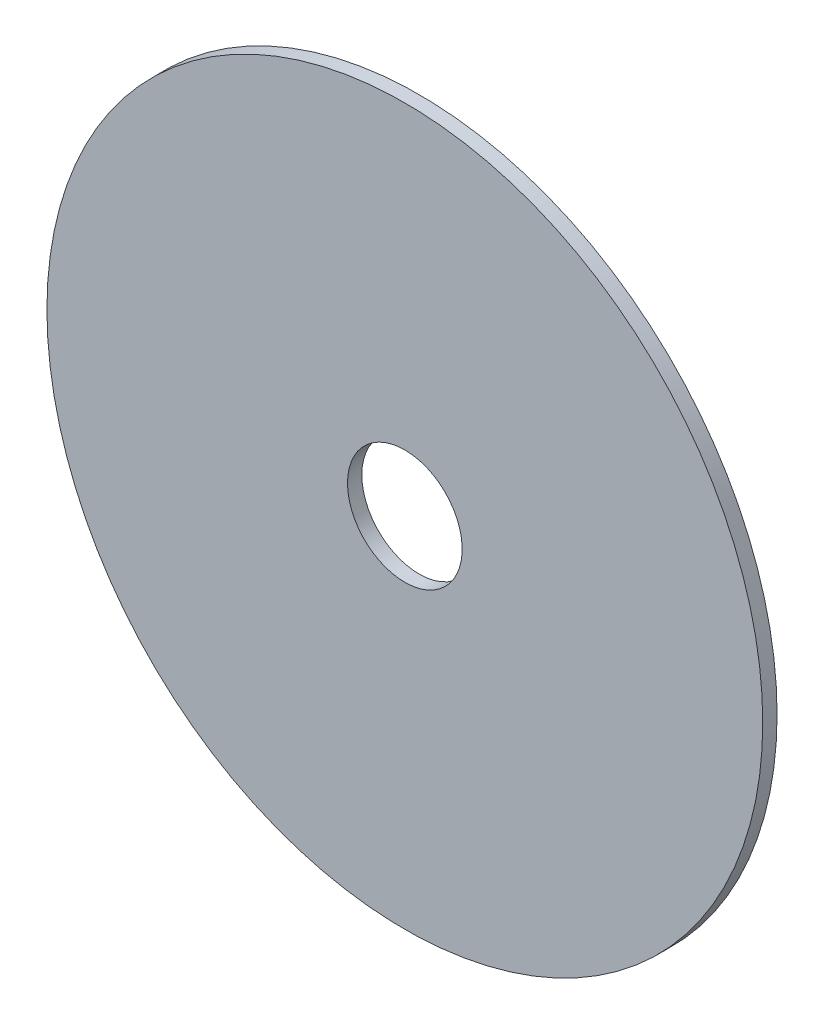
ISO-10303-21;
HEADER;
FILE_DESCRIPTION(('STEP AP214'),'2;1');
FILE_NAME('part.step','',(''),(''),'','','');
FILE_SCHEMA(('AUTOMOTIVE_DESIGN { 1 0 10303 214 1 1 1 1 }'));
ENDSEC;
DATA;
#1=APPLICATION_CONTEXT('core data for automotive mechanical design processes');
#2=APPLICATION_PROTOCOL_DEFINITION('international standard','automotive_design',2000,#1);
#3=PRODUCT_CONTEXT('',#1,'mechanical');
#4=PRODUCT('Part','Part','',(#3));
#5=PRODUCT_RELATED_PRODUCT_CATEGORY('part','',(#4));
#6=PRODUCT_DEFINITION_FORMATION('','',#4);
#7=PRODUCT_DEFINITION_CONTEXT('part definition',#1,'design');
#8=PRODUCT_DEFINITION('design','',#6,#7);
#9=PRODUCT_DEFINITION_SHAPE('','',#8);
#10=(LENGTH_UNIT() NAMED_UNIT(*) SI_UNIT(.MILLI.,.METRE.));
#11=(NAMED_UNIT(*) PLANE_ANGLE_UNIT() SI_UNIT($,.RADIAN.));
#12=(NAMED_UNIT(*) SI_UNIT($,.STERADIAN.) SOLID_ANGLE_UNIT());
#13=UNCERTAINTY_MEASURE_WITH_UNIT(LENGTH_MEASURE(1.E-05),#10,'distance_accuracy_value','');
#14=(GEOMETRIC_REPRESENTATION_CONTEXT(3) GLOBAL_UNCERTAINTY_ASSIGNED_CONTEXT((#13)) GLOBAL_UNIT_ASSIGNED_CONTEXT((#10,
#11,#12)) REPRESENTATION_CONTEXT('',''));
#15=CARTESIAN_POINT('',(0.,0.,0.));
#16=DIRECTION('',(0.,0.,1.));
#17=DIRECTION('',(1.,0.,0.));
#18=AXIS2_PLACEMENT_3D('',#15,#16,#17);
#19=CARTESIAN_POINT('',(0.,0.,-0.5));
#20=DIRECTION('',(0.,0.,1.));
#21=DIRECTION('',(1.,0.,0.));
#22=AXIS2_PLACEMENT_3D('',#19,#20,#21);
#23=PLANE('',#22);
#24=CARTESIAN_POINT('',(0.,0.,-0.5));
#25=DIRECTION('',(0.,0.,-1.));
#26=DIRECTION('',(-1.,0.,0.));
#27=AXIS2_PLACEMENT_3D('',#24,#25,#26);
#28=CIRCLE('',#27,25.);
#29=CARTESIAN_POINT('',(-25.,0.,-0.5));
#30=VERTEX_POINT('',#29);
#31=EDGE_CURVE('E27',#30,#30,#28,.F.);
#32=ORIENTED_EDGE('',*,*,#31,.F.);
#33=EDGE_LOOP('',(#32));
#34=FACE_BOUND('',#33,.T.);
#35=CARTESIAN_POINT('',(0.,0.,-0.5));
#36=DIRECTION('',(0.,0.,-1.));
#37=DIRECTION('',(-1.,0.,0.));
#38=AXIS2_PLACEMENT_3D('',#35,#36,#37);
#39=CIRCLE('',#38,4.005);
#40=CARTESIAN_POINT('',(-4.005,0.,-0.5));
#41=VERTEX_POINT('',#40);
#42=EDGE_CURVE('E18',#41,#41,#39,.F.);
#43=ORIENTED_EDGE('',*,*,#42,.T.);
#44=EDGE_LOOP('',(#43));
#45=FACE_BOUND('',#44,.T.);
#46=ADVANCED_FACE('F15',(#34,#45),#23,.F.);
#47=CARTESIAN_POINT('',(0.,0.,0.5));
#48=DIRECTION('',(0.,0.,-1.));
#49=DIRECTION('',(-1.,0.,0.));
#50=AXIS2_PLACEMENT_3D('',#47,#48,#49);
#51=CYLINDRICAL_SURFACE('',#50,4.005);
#52=ORIENTED_EDGE('',*,*,#42,.F.);
#53=EDGE_LOOP('',(#52));
#54=FACE_BOUND('',#53,.T.);
#55=CARTESIAN_POINT('',(0.,0.,0.5));
#56=DIRECTION('',(0.,0.,-1.));
#57=DIRECTION('',(-1.,0.,0.));
#58=AXIS2_PLACEMENT_3D('',#55,#56,#57);
#59=CIRCLE('',#58,4.005);
#60=CARTESIAN_POINT('',(-4.005,0.,0.5));
#61=VERTEX_POINT('',#60);
#62=EDGE_CURVE('E22',#61,#61,#59,.T.);
#63=ORIENTED_EDGE('',*,*,#62,.F.);
#64=EDGE_LOOP('',(#63));
#65=FACE_BOUND('',#64,.T.);
#66=ADVANCED_FACE('F36',(#54,#65),#51,.F.);
#67=CARTESIAN_POINT('',(0.,0.,0.5));
#68=DIRECTION('',(0.,0.,-1.));
#69=DIRECTION('',(-1.,0.,0.));
#70=AXIS2_PLACEMENT_3D('',#67,#68,#69);
#71=CYLINDRICAL_SURFACE('',#70,25.);
#72=ORIENTED_EDGE('',*,*,#31,.T.);
#73=EDGE_LOOP('',(#72));
#74=FACE_BOUND('',#73,.T.);
#75=CARTESIAN_POINT('',(0.,0.,0.5));
#76=DIRECTION('',(0.,0.,-1.));
#77=DIRECTION('',(-1.,0.,0.));
#78=AXIS2_PLACEMENT_3D('',#75,#76,#77);
#79=CIRCLE('',#78,25.);
#80=CARTESIAN_POINT('',(-25.,0.,0.5));
#81=VERTEX_POINT('',#80);
#82=EDGE_CURVE('E10',#81,#81,#79,.F.);
#83=ORIENTED_EDGE('',*,*,#82,.F.);
#84=EDGE_LOOP('',(#83));
#85=FACE_BOUND('',#84,.T.);
#86=ADVANCED_FACE('F39',(#74,#85),#71,.T.);
#87=CARTESIAN_POINT('',(0.,0.,0.5));
#88=DIRECTION('',(0.,0.,1.));
#89=DIRECTION('',(1.,0.,0.));
#90=AXIS2_PLACEMENT_3D('',#87,#88,#89);
#91=PLANE('',#90);
#92=ORIENTED_EDGE('',*,*,#82,.T.);
#93=EDGE_LOOP('',(#92));
#94=FACE_BOUND('',#93,.T.);
#95=ORIENTED_EDGE('',*,*,#62,.T.);
#96=EDGE_LOOP('',(#95));
#97=FACE_BOUND('',#96,.T.);
#98=ADVANCED_FACE('F42',(#94,#97),#91,.T.);
#99=CLOSED_SHELL('',(#46,#66,#86,#98));
#100=MANIFOLD_SOLID_BREP('B1',#99);
#101=ADVANCED_BREP_SHAPE_REPRESENTATION('',(#18,#100),#14);
#102=SHAPE_DEFINITION_REPRESENTATION(#9,#101);
ENDSEC;
END-ISO-10303-21;
